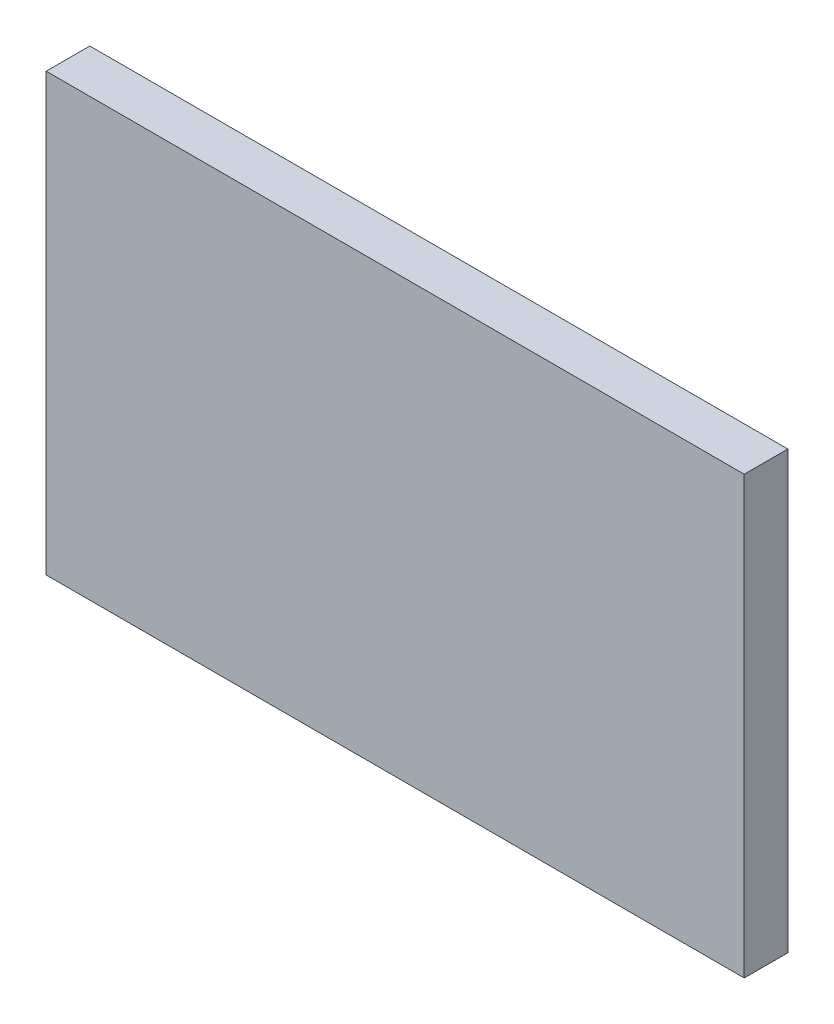
ISO-10303-21;
HEADER;
FILE_DESCRIPTION(('STEP AP214'),'2;1');
FILE_NAME('part.step','',(''),(''),'','','');
FILE_SCHEMA(('AUTOMOTIVE_DESIGN { 1 0 10303 214 1 1 1 1 }'));
ENDSEC;
DATA;
#1=APPLICATION_CONTEXT('core data for automotive mechanical design processes');
#2=APPLICATION_PROTOCOL_DEFINITION('international standard','automotive_design',2000,#1);
#3=PRODUCT_CONTEXT('',#1,'mechanical');
#4=PRODUCT('Part','Part','',(#3));
#5=PRODUCT_RELATED_PRODUCT_CATEGORY('part','',(#4));
#6=PRODUCT_DEFINITION_FORMATION('','',#4);
#7=PRODUCT_DEFINITION_CONTEXT('part definition',#1,'design');
#8=PRODUCT_DEFINITION('design','',#6,#7);
#9=PRODUCT_DEFINITION_SHAPE('','',#8);
#10=(LENGTH_UNIT() NAMED_UNIT(*) SI_UNIT(.MILLI.,.METRE.));
#11=(NAMED_UNIT(*) PLANE_ANGLE_UNIT() SI_UNIT($,.RADIAN.));
#12=(NAMED_UNIT(*) SI_UNIT($,.STERADIAN.) SOLID_ANGLE_UNIT());
#13=UNCERTAINTY_MEASURE_WITH_UNIT(LENGTH_MEASURE(1.E-05),#10,'distance_accuracy_value','');
#14=(GEOMETRIC_REPRESENTATION_CONTEXT(3) GLOBAL_UNCERTAINTY_ASSIGNED_CONTEXT((#13)) GLOBAL_UNIT_ASSIGNED_CONTEXT((#10,
#11,#12)) REPRESENTATION_CONTEXT('',''));
#15=CARTESIAN_POINT('',(0.,0.,0.));
#16=DIRECTION('',(0.,0.,1.));
#17=DIRECTION('',(1.,0.,0.));
#18=AXIS2_PLACEMENT_3D('',#15,#16,#17);
#19=CARTESIAN_POINT('',(-39.0191234914942,29.7538724373576,10.));
#20=DIRECTION('',(1.,0.,0.));
#21=DIRECTION('',(0.,1.,0.));
#22=AXIS2_PLACEMENT_3D('',#19,#20,#21);
#23=PLANE('',#22);
#24=DIRECTION('',(0.,-1.,0.));
#25=VECTOR('',#24,1.);
#26=CARTESIAN_POINT('',(-39.0191234914942,29.7538724373576,0.));
#27=LINE('',#26,#25);
#28=CARTESIAN_POINT('',(-39.0191234914942,29.7538724373576,0.));
#29=VERTEX_POINT('',#28);
#30=CARTESIAN_POINT('',(-39.0191234914942,-70.2461275626424,0.));
#31=VERTEX_POINT('',#30);
#32=EDGE_CURVE('E98',#29,#31,#27,.T.);
#33=ORIENTED_EDGE('',*,*,#32,.T.);
#34=DIRECTION('',(0.,0.,-1.));
#35=VECTOR('',#34,1.);
#36=CARTESIAN_POINT('',(-39.0191234914942,-70.2461275626424,10.));
#37=LINE('',#36,#35);
#38=CARTESIAN_POINT('',(-39.0191234914942,-70.2461275626424,10.));
#39=VERTEX_POINT('',#38);
#40=EDGE_CURVE('E11',#39,#31,#37,.T.);
#41=ORIENTED_EDGE('',*,*,#40,.F.);
#42=DIRECTION('',(0.,-1.,0.));
#43=VECTOR('',#42,1.);
#44=CARTESIAN_POINT('',(-39.0191234914942,29.7538724373576,10.));
#45=LINE('',#44,#43);
#46=CARTESIAN_POINT('',(-39.0191234914942,29.7538724373576,10.));
#47=VERTEX_POINT('',#46);
#48=EDGE_CURVE('E86',#47,#39,#45,.T.);
#49=ORIENTED_EDGE('',*,*,#48,.F.);
#50=DIRECTION('',(0.,0.,-1.));
#51=VECTOR('',#50,1.);
#52=CARTESIAN_POINT('',(-39.0191234914942,29.7538724373576,10.));
#53=LINE('',#52,#51);
#54=EDGE_CURVE('E94',#47,#29,#53,.T.);
#55=ORIENTED_EDGE('',*,*,#54,.T.);
#56=EDGE_LOOP('',(#33,#41,#49,#55));
#57=FACE_BOUND('',#56,.T.);
#58=ADVANCED_FACE('F35',(#57),#23,.F.);
#59=CARTESIAN_POINT('',(-39.0191234914942,-70.2461275626424,10.));
#60=DIRECTION('',(0.,1.,0.));
#61=DIRECTION('',(0.,0.,1.));
#62=AXIS2_PLACEMENT_3D('',#59,#60,#61);
#63=PLANE('',#62);
#64=DIRECTION('',(1.,0.,0.));
#65=VECTOR('',#64,1.);
#66=CARTESIAN_POINT('',(-39.0191234914942,-70.2461275626424,0.));
#67=LINE('',#66,#65);
#68=CARTESIAN_POINT('',(120.980876508506,-70.2461275626424,0.));
#69=VERTEX_POINT('',#68);
#70=EDGE_CURVE('E90',#31,#69,#67,.T.);
#71=ORIENTED_EDGE('',*,*,#70,.T.);
#72=DIRECTION('',(0.,0.,-1.));
#73=VECTOR('',#72,1.);
#74=CARTESIAN_POINT('',(120.980876508506,-70.2461275626424,10.));
#75=LINE('',#74,#73);
#76=CARTESIAN_POINT('',(120.980876508506,-70.2461275626424,10.));
#77=VERTEX_POINT('',#76);
#78=EDGE_CURVE('E43',#77,#69,#75,.T.);
#79=ORIENTED_EDGE('',*,*,#78,.F.);
#80=DIRECTION('',(1.,0.,0.));
#81=VECTOR('',#80,1.);
#82=CARTESIAN_POINT('',(-39.0191234914942,-70.2461275626424,10.));
#83=LINE('',#82,#81);
#84=EDGE_CURVE('E81',#39,#77,#83,.T.);
#85=ORIENTED_EDGE('',*,*,#84,.F.);
#86=ORIENTED_EDGE('',*,*,#40,.T.);
#87=EDGE_LOOP('',(#71,#79,#85,#86));
#88=FACE_BOUND('',#87,.T.);
#89=ADVANCED_FACE('F89',(#88),#63,.F.);
#90=CARTESIAN_POINT('',(120.980876508506,29.7538724373576,10.));
#91=DIRECTION('',(-1.,0.,0.));
#92=DIRECTION('',(0.,0.,1.));
#93=AXIS2_PLACEMENT_3D('',#90,#91,#92);
#94=PLANE('',#93);
#95=DIRECTION('',(0.,1.,0.));
#96=VECTOR('',#95,1.);
#97=CARTESIAN_POINT('',(120.980876508506,29.7538724373576,0.));
#98=LINE('',#97,#96);
#99=CARTESIAN_POINT('',(120.980876508506,29.7538724373576,0.));
#100=VERTEX_POINT('',#99);
#101=EDGE_CURVE('E68',#69,#100,#98,.T.);
#102=ORIENTED_EDGE('',*,*,#101,.T.);
#103=DIRECTION('',(0.,0.,-1.));
#104=VECTOR('',#103,1.);
#105=CARTESIAN_POINT('',(120.980876508506,29.7538724373576,10.));
#106=LINE('',#105,#104);
#107=CARTESIAN_POINT('',(120.980876508506,29.7538724373576,10.));
#108=VERTEX_POINT('',#107);
#109=EDGE_CURVE('E91',#108,#100,#106,.T.);
#110=ORIENTED_EDGE('',*,*,#109,.F.);
#111=DIRECTION('',(0.,1.,0.));
#112=VECTOR('',#111,1.);
#113=CARTESIAN_POINT('',(120.980876508506,29.7538724373576,10.));
#114=LINE('',#113,#112);
#115=EDGE_CURVE('E84',#77,#108,#114,.T.);
#116=ORIENTED_EDGE('',*,*,#115,.F.);
#117=ORIENTED_EDGE('',*,*,#78,.T.);
#118=EDGE_LOOP('',(#102,#110,#116,#117));
#119=FACE_BOUND('',#118,.T.);
#120=ADVANCED_FACE('F92',(#119),#94,.F.);
#121=CARTESIAN_POINT('',(-39.0191234914942,29.7538724373576,10.));
#122=DIRECTION('',(0.,-1.,0.));
#123=DIRECTION('',(0.,0.,-1.));
#124=AXIS2_PLACEMENT_3D('',#121,#122,#123);
#125=PLANE('',#124);
#126=DIRECTION('',(-1.,0.,0.));
#127=VECTOR('',#126,1.);
#128=CARTESIAN_POINT('',(-39.0191234914942,29.7538724373576,0.));
#129=LINE('',#128,#127);
#130=EDGE_CURVE('E74',#100,#29,#129,.T.);
#131=ORIENTED_EDGE('',*,*,#130,.T.);
#132=ORIENTED_EDGE('',*,*,#54,.F.);
#133=DIRECTION('',(-1.,0.,0.));
#134=VECTOR('',#133,1.);
#135=CARTESIAN_POINT('',(-39.0191234914942,29.7538724373576,10.));
#136=LINE('',#135,#134);
#137=EDGE_CURVE('E51',#108,#47,#136,.T.);
#138=ORIENTED_EDGE('',*,*,#137,.F.);
#139=ORIENTED_EDGE('',*,*,#109,.T.);
#140=EDGE_LOOP('',(#131,#132,#138,#139));
#141=FACE_BOUND('',#140,.T.);
#142=ADVANCED_FACE('F105',(#141),#125,.F.);
#143=CARTESIAN_POINT('',(0.,0.,10.));
#144=DIRECTION('',(0.,0.,1.));
#145=DIRECTION('',(1.,0.,0.));
#146=AXIS2_PLACEMENT_3D('',#143,#144,#145);
#147=PLANE('',#146);
#148=ORIENTED_EDGE('',*,*,#48,.T.);
#149=ORIENTED_EDGE('',*,*,#84,.T.);
#150=ORIENTED_EDGE('',*,*,#115,.T.);
#151=ORIENTED_EDGE('',*,*,#137,.T.);
#152=EDGE_LOOP('',(#148,#149,#150,#151));
#153=FACE_BOUND('',#152,.T.);
#154=ADVANCED_FACE('F82',(#153),#147,.T.);
#155=CARTESIAN_POINT('',(0.,0.,0.));
#156=DIRECTION('',(0.,0.,1.));
#157=DIRECTION('',(1.,0.,0.));
#158=AXIS2_PLACEMENT_3D('',#155,#156,#157);
#159=PLANE('',#158);
#160=ORIENTED_EDGE('',*,*,#32,.F.);
#161=ORIENTED_EDGE('',*,*,#130,.F.);
#162=ORIENTED_EDGE('',*,*,#101,.F.);
#163=ORIENTED_EDGE('',*,*,#70,.F.);
#164=EDGE_LOOP('',(#160,#161,#162,#163));
#165=FACE_BOUND('',#164,.T.);
#166=ADVANCED_FACE('F108',(#165),#159,.F.);
#167=CLOSED_SHELL('',(#58,#89,#120,#142,#154,#166));
#168=MANIFOLD_SOLID_BREP('B2',#167);
#169=ADVANCED_BREP_SHAPE_REPRESENTATION('',(#18,#168),#14);
#170=SHAPE_DEFINITION_REPRESENTATION(#9,#169);
ENDSEC;
END-ISO-10303-21;
